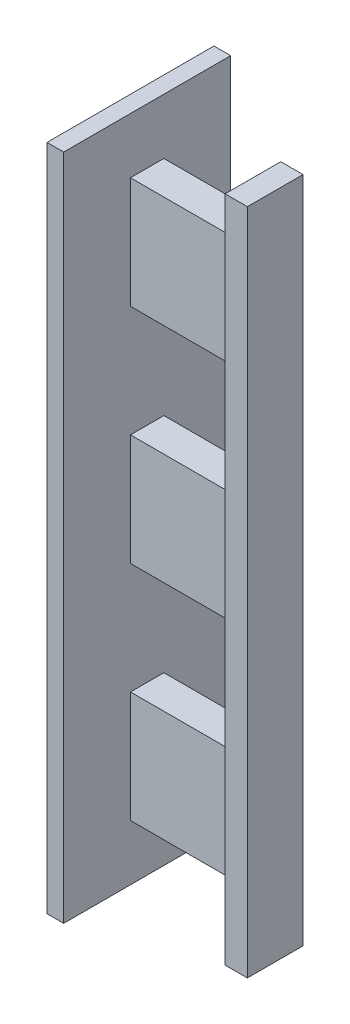
ISO-10303-21;
HEADER;
FILE_DESCRIPTION(('STEP AP214'),'2;1');
FILE_NAME('part.step','',(''),(''),'','','');
FILE_SCHEMA(('AUTOMOTIVE_DESIGN { 1 0 10303 214 1 1 1 1 }'));
ENDSEC;
DATA;
#1=APPLICATION_CONTEXT('core data for automotive mechanical design processes');
#2=APPLICATION_PROTOCOL_DEFINITION('international standard','automotive_design',2000,#1);
#3=PRODUCT_CONTEXT('',#1,'mechanical');
#4=PRODUCT('Part','Part','',(#3));
#5=PRODUCT_RELATED_PRODUCT_CATEGORY('part','',(#4));
#6=PRODUCT_DEFINITION_FORMATION('','',#4);
#7=PRODUCT_DEFINITION_CONTEXT('part definition',#1,'design');
#8=PRODUCT_DEFINITION('design','',#6,#7);
#9=PRODUCT_DEFINITION_SHAPE('','',#8);
#10=(LENGTH_UNIT() NAMED_UNIT(*) SI_UNIT(.MILLI.,.METRE.));
#11=(NAMED_UNIT(*) PLANE_ANGLE_UNIT() SI_UNIT($,.RADIAN.));
#12=(NAMED_UNIT(*) SI_UNIT($,.STERADIAN.) SOLID_ANGLE_UNIT());
#13=UNCERTAINTY_MEASURE_WITH_UNIT(LENGTH_MEASURE(1.E-05),#10,'distance_accuracy_value','');
#14=(GEOMETRIC_REPRESENTATION_CONTEXT(3) GLOBAL_UNCERTAINTY_ASSIGNED_CONTEXT((#13)) GLOBAL_UNIT_ASSIGNED_CONTEXT((#10,
#11,#12)) REPRESENTATION_CONTEXT('',''));
#15=CARTESIAN_POINT('',(0.,0.,0.));
#16=DIRECTION('',(0.,0.,1.));
#17=DIRECTION('',(1.,0.,0.));
#18=AXIS2_PLACEMENT_3D('',#15,#16,#17);
#19=CARTESIAN_POINT('',(0.,0.,0.));
#20=DIRECTION('',(-1.,0.,0.));
#21=DIRECTION('',(0.,0.,1.));
#22=AXIS2_PLACEMENT_3D('',#19,#20,#21);
#23=PLANE('',#22);
#24=DIRECTION('',(0.,1.,0.));
#25=VECTOR('',#24,1.);
#26=CARTESIAN_POINT('',(0.,-30.,-1.50000000000001));
#27=LINE('',#26,#25);
#28=CARTESIAN_POINT('',(0.,25.,-1.5));
#29=VERTEX_POINT('',#28);
#30=CARTESIAN_POINT('',(0.,30.,-1.49999999999999));
#31=VERTEX_POINT('',#30);
#32=EDGE_CURVE('E338',#29,#31,#27,.T.);
#33=ORIENTED_EDGE('',*,*,#32,.F.);
#34=DIRECTION('',(0.,0.,-1.));
#35=VECTOR('',#34,1.);
#36=CARTESIAN_POINT('',(0.,25.,-1.50000000000007));
#37=LINE('',#36,#35);
#38=CARTESIAN_POINT('',(0.,25.,1.49999999999993));
#39=VERTEX_POINT('',#38);
#40=EDGE_CURVE('E233',#39,#29,#37,.T.);
#41=ORIENTED_EDGE('',*,*,#40,.F.);
#42=DIRECTION('',(0.,1.,0.));
#43=VECTOR('',#42,1.);
#44=CARTESIAN_POINT('',(0.,15.,1.49999999999993));
#45=LINE('',#44,#43);
#46=CARTESIAN_POINT('',(0.,15.,1.49999999999993));
#47=VERTEX_POINT('',#46);
#48=EDGE_CURVE('E237',#47,#39,#45,.T.);
#49=ORIENTED_EDGE('',*,*,#48,.F.);
#50=DIRECTION('',(0.,0.,1.));
#51=VECTOR('',#50,1.);
#52=CARTESIAN_POINT('',(0.,15.,-1.50000000000007));
#53=LINE('',#52,#51);
#54=CARTESIAN_POINT('',(0.,15.,-1.50000000000007));
#55=VERTEX_POINT('',#54);
#56=EDGE_CURVE('E230',#55,#47,#53,.T.);
#57=ORIENTED_EDGE('',*,*,#56,.F.);
#58=CARTESIAN_POINT('',(0.,5.,-1.5));
#59=VERTEX_POINT('',#58);
#60=EDGE_CURVE('E360',#59,#55,#27,.T.);
#61=ORIENTED_EDGE('',*,*,#60,.F.);
#62=DIRECTION('',(0.,0.,-1.));
#63=VECTOR('',#62,1.);
#64=CARTESIAN_POINT('',(0.,5.,-1.5));
#65=LINE('',#64,#63);
#66=CARTESIAN_POINT('',(0.,5.,1.5));
#67=VERTEX_POINT('',#66);
#68=EDGE_CURVE('E316',#67,#59,#65,.T.);
#69=ORIENTED_EDGE('',*,*,#68,.F.);
#70=DIRECTION('',(0.,1.,0.));
#71=VECTOR('',#70,1.);
#72=CARTESIAN_POINT('',(0.,-5.,1.5));
#73=LINE('',#72,#71);
#74=CARTESIAN_POINT('',(0.,-5.,1.5));
#75=VERTEX_POINT('',#74);
#76=EDGE_CURVE('E280',#75,#67,#73,.T.);
#77=ORIENTED_EDGE('',*,*,#76,.F.);
#78=DIRECTION('',(0.,0.,1.));
#79=VECTOR('',#78,1.);
#80=CARTESIAN_POINT('',(0.,-5.,-1.5));
#81=LINE('',#80,#79);
#82=CARTESIAN_POINT('',(0.,-5.,-1.5));
#83=VERTEX_POINT('',#82);
#84=EDGE_CURVE('E300',#83,#75,#81,.T.);
#85=ORIENTED_EDGE('',*,*,#84,.F.);
#86=CARTESIAN_POINT('',(0.,-15.,-1.49999999999979));
#87=VERTEX_POINT('',#86);
#88=EDGE_CURVE('E359',#87,#83,#27,.T.);
#89=ORIENTED_EDGE('',*,*,#88,.F.);
#90=DIRECTION('',(0.,0.,-1.));
#91=VECTOR('',#90,1.);
#92=CARTESIAN_POINT('',(0.,-15.,-1.49999999999979));
#93=LINE('',#92,#91);
#94=CARTESIAN_POINT('',(0.,-15.,1.50000000000021));
#95=VERTEX_POINT('',#94);
#96=EDGE_CURVE('E272',#95,#87,#93,.T.);
#97=ORIENTED_EDGE('',*,*,#96,.F.);
#98=DIRECTION('',(0.,1.,0.));
#99=VECTOR('',#98,1.);
#100=CARTESIAN_POINT('',(0.,-25.,1.50000000000021));
#101=LINE('',#100,#99);
#102=CARTESIAN_POINT('',(0.,-25.,1.50000000000021));
#103=VERTEX_POINT('',#102);
#104=EDGE_CURVE('E276',#103,#95,#101,.T.);
#105=ORIENTED_EDGE('',*,*,#104,.F.);
#106=DIRECTION('',(0.,0.,1.));
#107=VECTOR('',#106,1.);
#108=CARTESIAN_POINT('',(0.,-25.,-1.49999999999979));
#109=LINE('',#108,#107);
#110=CARTESIAN_POINT('',(0.,-25.,-1.5));
#111=VERTEX_POINT('',#110);
#112=EDGE_CURVE('E269',#111,#103,#109,.T.);
#113=ORIENTED_EDGE('',*,*,#112,.F.);
#114=CARTESIAN_POINT('',(0.,-30.,-1.50000000000001));
#115=VERTEX_POINT('',#114);
#116=EDGE_CURVE('E354',#115,#111,#27,.T.);
#117=ORIENTED_EDGE('',*,*,#116,.F.);
#118=DIRECTION('',(0.,0.,-1.));
#119=VECTOR('',#118,1.);
#120=CARTESIAN_POINT('',(0.,-30.,3.5));
#121=LINE('',#120,#119);
#122=CARTESIAN_POINT('',(0.,-30.,3.5));
#123=VERTEX_POINT('',#122);
#124=EDGE_CURVE('E344',#123,#115,#121,.T.);
#125=ORIENTED_EDGE('',*,*,#124,.F.);
#126=DIRECTION('',(0.,-1.,0.));
#127=VECTOR('',#126,1.);
#128=CARTESIAN_POINT('',(0.,-30.,3.5));
#129=LINE('',#128,#127);
#130=CARTESIAN_POINT('',(0.,30.,3.50000000000001));
#131=VERTEX_POINT('',#130);
#132=EDGE_CURVE('E363',#131,#123,#129,.T.);
#133=ORIENTED_EDGE('',*,*,#132,.F.);
#134=DIRECTION('',(0.,0.,1.));
#135=VECTOR('',#134,1.);
#136=CARTESIAN_POINT('',(0.,30.,3.50000000000001));
#137=LINE('',#136,#135);
#138=EDGE_CURVE('E358',#31,#131,#137,.T.);
#139=ORIENTED_EDGE('',*,*,#138,.F.);
#140=EDGE_LOOP('',(#33,#41,#49,#57,#61,#69,#77,#85,#89,#97,#105,#113,#117,#125,#133,#139));
#141=FACE_BOUND('',#140,.T.);
#142=ADVANCED_FACE('F45',(#141),#23,.T.);
#143=CARTESIAN_POINT('',(2.,-30.,-1.50000000000001));
#144=DIRECTION('',(0.,0.,1.));
#145=DIRECTION('',(0.,-1.,0.));
#146=AXIS2_PLACEMENT_3D('',#143,#144,#145);
#147=PLANE('',#146);
#148=ORIENTED_EDGE('',*,*,#116,.T.);
#149=DIRECTION('',(1.,0.,0.));
#150=VECTOR('',#149,1.);
#151=CARTESIAN_POINT('',(-10.5,-25.,-1.49999999999979));
#152=LINE('',#151,#150);
#153=CARTESIAN_POINT('',(-10.5,-25.,-1.49999999999979));
#154=VERTEX_POINT('',#153);
#155=EDGE_CURVE('E69',#154,#111,#152,.T.);
#156=ORIENTED_EDGE('',*,*,#155,.F.);
#157=DIRECTION('',(0.,-1.,0.));
#158=VECTOR('',#157,1.);
#159=CARTESIAN_POINT('',(-10.5,-25.,-1.49999999999979));
#160=LINE('',#159,#158);
#161=CARTESIAN_POINT('',(-10.5,-15.,-1.49999999999979));
#162=VERTEX_POINT('',#161);
#163=EDGE_CURVE('E284',#162,#154,#160,.T.);
#164=ORIENTED_EDGE('',*,*,#163,.F.);
#165=DIRECTION('',(1.,0.,0.));
#166=VECTOR('',#165,1.);
#167=CARTESIAN_POINT('',(-10.5,-15.,-1.49999999999979));
#168=LINE('',#167,#166);
#169=EDGE_CURVE('E258',#162,#87,#168,.T.);
#170=ORIENTED_EDGE('',*,*,#169,.T.);
#171=ORIENTED_EDGE('',*,*,#88,.T.);
#172=DIRECTION('',(1.,0.,0.));
#173=VECTOR('',#172,1.);
#174=CARTESIAN_POINT('',(-10.5,-5.,-1.5));
#175=LINE('',#174,#173);
#176=CARTESIAN_POINT('',(-10.5,-5.,-1.5));
#177=VERTEX_POINT('',#176);
#178=EDGE_CURVE('E326',#177,#83,#175,.T.);
#179=ORIENTED_EDGE('',*,*,#178,.F.);
#180=DIRECTION('',(0.,-1.,0.));
#181=VECTOR('',#180,1.);
#182=CARTESIAN_POINT('',(-10.5,-5.,-1.5));
#183=LINE('',#182,#181);
#184=CARTESIAN_POINT('',(-10.5,5.,-1.5));
#185=VERTEX_POINT('',#184);
#186=EDGE_CURVE('E304',#185,#177,#183,.T.);
#187=ORIENTED_EDGE('',*,*,#186,.F.);
#188=DIRECTION('',(1.,0.,0.));
#189=VECTOR('',#188,1.);
#190=CARTESIAN_POINT('',(-10.5,5.,-1.5));
#191=LINE('',#190,#189);
#192=EDGE_CURVE('E330',#185,#59,#191,.T.);
#193=ORIENTED_EDGE('',*,*,#192,.T.);
#194=ORIENTED_EDGE('',*,*,#60,.T.);
#195=DIRECTION('',(1.,0.,0.));
#196=VECTOR('',#195,1.);
#197=CARTESIAN_POINT('',(-10.5,15.,-1.50000000000007));
#198=LINE('',#197,#196);
#199=CARTESIAN_POINT('',(-10.5,15.,-1.50000000000007));
#200=VERTEX_POINT('',#199);
#201=EDGE_CURVE('E222',#200,#55,#198,.T.);
#202=ORIENTED_EDGE('',*,*,#201,.F.);
#203=DIRECTION('',(0.,-1.,0.));
#204=VECTOR('',#203,1.);
#205=CARTESIAN_POINT('',(-10.5,15.,-1.50000000000007));
#206=LINE('',#205,#204);
#207=CARTESIAN_POINT('',(-10.5,25.,-1.50000000000007));
#208=VERTEX_POINT('',#207);
#209=EDGE_CURVE('E245',#208,#200,#206,.T.);
#210=ORIENTED_EDGE('',*,*,#209,.F.);
#211=DIRECTION('',(1.,0.,0.));
#212=VECTOR('',#211,1.);
#213=CARTESIAN_POINT('',(-10.5,25.,-1.50000000000007));
#214=LINE('',#213,#212);
#215=EDGE_CURVE('E61',#208,#29,#214,.T.);
#216=ORIENTED_EDGE('',*,*,#215,.T.);
#217=ORIENTED_EDGE('',*,*,#32,.T.);
#218=DIRECTION('',(-1.,0.,0.));
#219=VECTOR('',#218,1.);
#220=CARTESIAN_POINT('',(2.,30.,-1.49999999999999));
#221=LINE('',#220,#219);
#222=CARTESIAN_POINT('',(2.,30.,-1.49999999999999));
#223=VERTEX_POINT('',#222);
#224=EDGE_CURVE('E11',#223,#31,#221,.T.);
#225=ORIENTED_EDGE('',*,*,#224,.F.);
#226=DIRECTION('',(0.,1.,0.));
#227=VECTOR('',#226,1.);
#228=CARTESIAN_POINT('',(2.,-30.,-1.50000000000001));
#229=LINE('',#228,#227);
#230=CARTESIAN_POINT('',(2.,-30.,-1.50000000000001));
#231=VERTEX_POINT('',#230);
#232=EDGE_CURVE('E339',#231,#223,#229,.T.);
#233=ORIENTED_EDGE('',*,*,#232,.F.);
#234=DIRECTION('',(-1.,0.,0.));
#235=VECTOR('',#234,1.);
#236=CARTESIAN_POINT('',(2.,-30.,-1.50000000000001));
#237=LINE('',#236,#235);
#238=EDGE_CURVE('E353',#231,#115,#237,.T.);
#239=ORIENTED_EDGE('',*,*,#238,.T.);
#240=EDGE_LOOP('',(#148,#156,#164,#170,#171,#179,#187,#193,#194,#202,#210,#216,#217,#225,#233,#239));
#241=FACE_BOUND('',#240,.T.);
#242=ADVANCED_FACE('F47',(#241),#147,.F.);
#243=CARTESIAN_POINT('',(2.,30.,3.50000000000001));
#244=DIRECTION('',(0.,-1.,0.));
#245=DIRECTION('',(0.,0.,-1.));
#246=AXIS2_PLACEMENT_3D('',#243,#244,#245);
#247=PLANE('',#246);
#248=ORIENTED_EDGE('',*,*,#138,.T.);
#249=DIRECTION('',(-1.,0.,0.));
#250=VECTOR('',#249,1.);
#251=CARTESIAN_POINT('',(2.,30.,3.50000000000001));
#252=LINE('',#251,#250);
#253=CARTESIAN_POINT('',(2.,30.,3.50000000000001));
#254=VERTEX_POINT('',#253);
#255=EDGE_CURVE('E54',#254,#131,#252,.T.);
#256=ORIENTED_EDGE('',*,*,#255,.F.);
#257=DIRECTION('',(0.,0.,1.));
#258=VECTOR('',#257,1.);
#259=CARTESIAN_POINT('',(2.,30.,3.50000000000001));
#260=LINE('',#259,#258);
#261=EDGE_CURVE('E343',#223,#254,#260,.T.);
#262=ORIENTED_EDGE('',*,*,#261,.F.);
#263=ORIENTED_EDGE('',*,*,#224,.T.);
#264=EDGE_LOOP('',(#248,#256,#262,#263));
#265=FACE_BOUND('',#264,.T.);
#266=ADVANCED_FACE('F396',(#265),#247,.F.);
#267=CARTESIAN_POINT('',(2.,-30.,3.5));
#268=DIRECTION('',(0.,0.,-1.));
#269=DIRECTION('',(0.,1.,0.));
#270=AXIS2_PLACEMENT_3D('',#267,#268,#269);
#271=PLANE('',#270);
#272=ORIENTED_EDGE('',*,*,#132,.T.);
#273=DIRECTION('',(-1.,0.,0.));
#274=VECTOR('',#273,1.);
#275=CARTESIAN_POINT('',(2.,-30.,3.5));
#276=LINE('',#275,#274);
#277=CARTESIAN_POINT('',(2.,-30.,3.5));
#278=VERTEX_POINT('',#277);
#279=EDGE_CURVE('E371',#278,#123,#276,.T.);
#280=ORIENTED_EDGE('',*,*,#279,.F.);
#281=DIRECTION('',(0.,-1.,0.));
#282=VECTOR('',#281,1.);
#283=CARTESIAN_POINT('',(2.,-30.,3.5));
#284=LINE('',#283,#282);
#285=EDGE_CURVE('E347',#254,#278,#284,.T.);
#286=ORIENTED_EDGE('',*,*,#285,.F.);
#287=ORIENTED_EDGE('',*,*,#255,.T.);
#288=EDGE_LOOP('',(#272,#280,#286,#287));
#289=FACE_BOUND('',#288,.T.);
#290=ADVANCED_FACE('F380',(#289),#271,.F.);
#291=CARTESIAN_POINT('',(2.,-30.,3.5));
#292=DIRECTION('',(0.,1.,0.));
#293=DIRECTION('',(0.,0.,1.));
#294=AXIS2_PLACEMENT_3D('',#291,#292,#293);
#295=PLANE('',#294);
#296=ORIENTED_EDGE('',*,*,#124,.T.);
#297=ORIENTED_EDGE('',*,*,#238,.F.);
#298=DIRECTION('',(0.,0.,-1.));
#299=VECTOR('',#298,1.);
#300=CARTESIAN_POINT('',(2.,-30.,3.5));
#301=LINE('',#300,#299);
#302=EDGE_CURVE('E350',#278,#231,#301,.T.);
#303=ORIENTED_EDGE('',*,*,#302,.F.);
#304=ORIENTED_EDGE('',*,*,#279,.T.);
#305=EDGE_LOOP('',(#296,#297,#303,#304));
#306=FACE_BOUND('',#305,.T.);
#307=ADVANCED_FACE('F390',(#306),#295,.F.);
#308=CARTESIAN_POINT('',(2.,0.,0.));
#309=DIRECTION('',(-1.,0.,0.));
#310=DIRECTION('',(0.,0.,1.));
#311=AXIS2_PLACEMENT_3D('',#308,#309,#310);
#312=PLANE('',#311);
#313=ORIENTED_EDGE('',*,*,#232,.T.);
#314=ORIENTED_EDGE('',*,*,#261,.T.);
#315=ORIENTED_EDGE('',*,*,#285,.T.);
#316=ORIENTED_EDGE('',*,*,#302,.T.);
#317=EDGE_LOOP('',(#313,#314,#315,#316));
#318=FACE_BOUND('',#317,.T.);
#319=ADVANCED_FACE('F395',(#318),#312,.F.);
#320=CARTESIAN_POINT('',(-10.5,-5.,1.5));
#321=DIRECTION('',(0.,0.,-1.));
#322=DIRECTION('',(-1.,0.,0.));
#323=AXIS2_PLACEMENT_3D('',#320,#321,#322);
#324=PLANE('',#323);
#325=ORIENTED_EDGE('',*,*,#76,.T.);
#326=DIRECTION('',(1.,0.,0.));
#327=VECTOR('',#326,1.);
#328=CARTESIAN_POINT('',(-10.5,5.,1.5));
#329=LINE('',#328,#327);
#330=CARTESIAN_POINT('',(-10.5,5.,1.5));
#331=VERTEX_POINT('',#330);
#332=EDGE_CURVE('E334',#331,#67,#329,.T.);
#333=ORIENTED_EDGE('',*,*,#332,.F.);
#334=DIRECTION('',(0.,1.,0.));
#335=VECTOR('',#334,1.);
#336=CARTESIAN_POINT('',(-10.5,-5.,1.5));
#337=LINE('',#336,#335);
#338=CARTESIAN_POINT('',(-10.5,-5.,1.5));
#339=VERTEX_POINT('',#338);
#340=EDGE_CURVE('E295',#339,#331,#337,.T.);
#341=ORIENTED_EDGE('',*,*,#340,.F.);
#342=DIRECTION('',(1.,0.,0.));
#343=VECTOR('',#342,1.);
#344=CARTESIAN_POINT('',(-10.5,-5.,1.5));
#345=LINE('',#344,#343);
#346=EDGE_CURVE('E312',#339,#75,#345,.T.);
#347=ORIENTED_EDGE('',*,*,#346,.T.);
#348=EDGE_LOOP('',(#325,#333,#341,#347));
#349=FACE_BOUND('',#348,.T.);
#350=ADVANCED_FACE('F414',(#349),#324,.F.);
#351=CARTESIAN_POINT('',(-10.5,5.,-1.5));
#352=DIRECTION('',(0.,-1.,0.));
#353=DIRECTION('',(0.,0.,-1.));
#354=AXIS2_PLACEMENT_3D('',#351,#352,#353);
#355=PLANE('',#354);
#356=ORIENTED_EDGE('',*,*,#68,.T.);
#357=ORIENTED_EDGE('',*,*,#192,.F.);
#358=DIRECTION('',(0.,0.,-1.));
#359=VECTOR('',#358,1.);
#360=CARTESIAN_POINT('',(-10.5,5.,-1.5));
#361=LINE('',#360,#359);
#362=EDGE_CURVE('E299',#331,#185,#361,.T.);
#363=ORIENTED_EDGE('',*,*,#362,.F.);
#364=ORIENTED_EDGE('',*,*,#332,.T.);
#365=EDGE_LOOP('',(#356,#357,#363,#364));
#366=FACE_BOUND('',#365,.T.);
#367=ADVANCED_FACE('F418',(#366),#355,.F.);
#368=CARTESIAN_POINT('',(-10.5,-5.,-1.5));
#369=DIRECTION('',(0.,1.,0.));
#370=DIRECTION('',(0.,0.,1.));
#371=AXIS2_PLACEMENT_3D('',#368,#369,#370);
#372=PLANE('',#371);
#373=ORIENTED_EDGE('',*,*,#84,.T.);
#374=ORIENTED_EDGE('',*,*,#346,.F.);
#375=DIRECTION('',(0.,0.,1.));
#376=VECTOR('',#375,1.);
#377=CARTESIAN_POINT('',(-10.5,-5.,-1.5));
#378=LINE('',#377,#376);
#379=EDGE_CURVE('E308',#177,#339,#378,.T.);
#380=ORIENTED_EDGE('',*,*,#379,.F.);
#381=ORIENTED_EDGE('',*,*,#178,.T.);
#382=EDGE_LOOP('',(#373,#374,#380,#381));
#383=FACE_BOUND('',#382,.T.);
#384=ADVANCED_FACE('F423',(#383),#372,.F.);
#385=CARTESIAN_POINT('',(-10.5,-25.,1.50000000000021));
#386=DIRECTION('',(0.,0.,-1.));
#387=DIRECTION('',(-1.,0.,0.));
#388=AXIS2_PLACEMENT_3D('',#385,#386,#387);
#389=PLANE('',#388);
#390=ORIENTED_EDGE('',*,*,#104,.T.);
#391=DIRECTION('',(1.,0.,0.));
#392=VECTOR('',#391,1.);
#393=CARTESIAN_POINT('',(-10.5,-15.,1.50000000000021));
#394=LINE('',#393,#392);
#395=CARTESIAN_POINT('',(-10.5,-15.,1.50000000000021));
#396=VERTEX_POINT('',#395);
#397=EDGE_CURVE('E241',#396,#95,#394,.T.);
#398=ORIENTED_EDGE('',*,*,#397,.F.);
#399=DIRECTION('',(0.,1.,0.));
#400=VECTOR('',#399,1.);
#401=CARTESIAN_POINT('',(-10.5,-25.,1.50000000000021));
#402=LINE('',#401,#400);
#403=CARTESIAN_POINT('',(-10.5,-25.,1.50000000000021));
#404=VERTEX_POINT('',#403);
#405=EDGE_CURVE('E273',#404,#396,#402,.T.);
#406=ORIENTED_EDGE('',*,*,#405,.F.);
#407=DIRECTION('',(1.,0.,0.));
#408=VECTOR('',#407,1.);
#409=CARTESIAN_POINT('',(-10.5,-25.,1.50000000000021));
#410=LINE('',#409,#408);
#411=EDGE_CURVE('E264',#404,#103,#410,.T.);
#412=ORIENTED_EDGE('',*,*,#411,.T.);
#413=EDGE_LOOP('',(#390,#398,#406,#412));
#414=FACE_BOUND('',#413,.T.);
#415=ADVANCED_FACE('F429',(#414),#389,.F.);
#416=CARTESIAN_POINT('',(-10.5,-15.,-1.49999999999979));
#417=DIRECTION('',(0.,-1.,0.));
#418=DIRECTION('',(0.,0.,-1.));
#419=AXIS2_PLACEMENT_3D('',#416,#417,#418);
#420=PLANE('',#419);
#421=ORIENTED_EDGE('',*,*,#96,.T.);
#422=ORIENTED_EDGE('',*,*,#169,.F.);
#423=DIRECTION('',(0.,0.,-1.));
#424=VECTOR('',#423,1.);
#425=CARTESIAN_POINT('',(-10.5,-15.,-1.49999999999979));
#426=LINE('',#425,#424);
#427=EDGE_CURVE('E288',#396,#162,#426,.T.);
#428=ORIENTED_EDGE('',*,*,#427,.F.);
#429=ORIENTED_EDGE('',*,*,#397,.T.);
#430=EDGE_LOOP('',(#421,#422,#428,#429));
#431=FACE_BOUND('',#430,.T.);
#432=ADVANCED_FACE('F435',(#431),#420,.F.);
#433=CARTESIAN_POINT('',(-10.5,-25.,-1.49999999999979));
#434=DIRECTION('',(0.,1.,0.));
#435=DIRECTION('',(0.,0.,1.));
#436=AXIS2_PLACEMENT_3D('',#433,#434,#435);
#437=PLANE('',#436);
#438=ORIENTED_EDGE('',*,*,#112,.T.);
#439=ORIENTED_EDGE('',*,*,#411,.F.);
#440=DIRECTION('',(0.,0.,1.));
#441=VECTOR('',#440,1.);
#442=CARTESIAN_POINT('',(-10.5,-25.,-1.49999999999979));
#443=LINE('',#442,#441);
#444=EDGE_CURVE('E268',#154,#404,#443,.T.);
#445=ORIENTED_EDGE('',*,*,#444,.F.);
#446=ORIENTED_EDGE('',*,*,#155,.T.);
#447=EDGE_LOOP('',(#438,#439,#445,#446));
#448=FACE_BOUND('',#447,.T.);
#449=ADVANCED_FACE('F431',(#448),#437,.F.);
#450=CARTESIAN_POINT('',(-10.5,15.,1.49999999999993));
#451=DIRECTION('',(0.,0.,-1.));
#452=DIRECTION('',(-1.,0.,0.));
#453=AXIS2_PLACEMENT_3D('',#450,#451,#452);
#454=PLANE('',#453);
#455=ORIENTED_EDGE('',*,*,#48,.T.);
#456=DIRECTION('',(1.,0.,0.));
#457=VECTOR('',#456,1.);
#458=CARTESIAN_POINT('',(-10.5,25.,1.49999999999993));
#459=LINE('',#458,#457);
#460=CARTESIAN_POINT('',(-10.5,25.,1.49999999999993));
#461=VERTEX_POINT('',#460);
#462=EDGE_CURVE('E211',#461,#39,#459,.T.);
#463=ORIENTED_EDGE('',*,*,#462,.F.);
#464=DIRECTION('',(0.,1.,0.));
#465=VECTOR('',#464,1.);
#466=CARTESIAN_POINT('',(-10.5,15.,1.49999999999993));
#467=LINE('',#466,#465);
#468=CARTESIAN_POINT('',(-10.5,15.,1.49999999999993));
#469=VERTEX_POINT('',#468);
#470=EDGE_CURVE('E234',#469,#461,#467,.T.);
#471=ORIENTED_EDGE('',*,*,#470,.F.);
#472=DIRECTION('',(1.,0.,0.));
#473=VECTOR('',#472,1.);
#474=CARTESIAN_POINT('',(-10.5,15.,1.49999999999993));
#475=LINE('',#474,#473);
#476=EDGE_CURVE('E225',#469,#47,#475,.T.);
#477=ORIENTED_EDGE('',*,*,#476,.T.);
#478=EDGE_LOOP('',(#455,#463,#471,#477));
#479=FACE_BOUND('',#478,.T.);
#480=ADVANCED_FACE('F434',(#479),#454,.F.);
#481=CARTESIAN_POINT('',(-10.5,25.,-1.50000000000007));
#482=DIRECTION('',(0.,-1.,0.));
#483=DIRECTION('',(0.,0.,-1.));
#484=AXIS2_PLACEMENT_3D('',#481,#482,#483);
#485=PLANE('',#484);
#486=ORIENTED_EDGE('',*,*,#40,.T.);
#487=ORIENTED_EDGE('',*,*,#215,.F.);
#488=DIRECTION('',(0.,0.,-1.));
#489=VECTOR('',#488,1.);
#490=CARTESIAN_POINT('',(-10.5,25.,-1.50000000000007));
#491=LINE('',#490,#489);
#492=EDGE_CURVE('E249',#461,#208,#491,.T.);
#493=ORIENTED_EDGE('',*,*,#492,.F.);
#494=ORIENTED_EDGE('',*,*,#462,.T.);
#495=EDGE_LOOP('',(#486,#487,#493,#494));
#496=FACE_BOUND('',#495,.T.);
#497=ADVANCED_FACE('F446',(#496),#485,.F.);
#498=CARTESIAN_POINT('',(-10.5,15.,-1.50000000000007));
#499=DIRECTION('',(0.,1.,0.));
#500=DIRECTION('',(0.,0.,1.));
#501=AXIS2_PLACEMENT_3D('',#498,#499,#500);
#502=PLANE('',#501);
#503=ORIENTED_EDGE('',*,*,#56,.T.);
#504=ORIENTED_EDGE('',*,*,#476,.F.);
#505=DIRECTION('',(0.,0.,1.));
#506=VECTOR('',#505,1.);
#507=CARTESIAN_POINT('',(-10.5,15.,-1.50000000000007));
#508=LINE('',#507,#506);
#509=EDGE_CURVE('E229',#200,#469,#508,.T.);
#510=ORIENTED_EDGE('',*,*,#509,.F.);
#511=ORIENTED_EDGE('',*,*,#201,.T.);
#512=EDGE_LOOP('',(#503,#504,#510,#511));
#513=FACE_BOUND('',#512,.T.);
#514=ADVANCED_FACE('F442',(#513),#502,.F.);
#515=CARTESIAN_POINT('',(-10.5,0.,0.));
#516=DIRECTION('',(1.,0.,0.));
#517=DIRECTION('',(0.,0.,-1.));
#518=AXIS2_PLACEMENT_3D('',#515,#516,#517);
#519=PLANE('',#518);
#520=ORIENTED_EDGE('',*,*,#427,.T.);
#521=ORIENTED_EDGE('',*,*,#163,.T.);
#522=ORIENTED_EDGE('',*,*,#444,.T.);
#523=ORIENTED_EDGE('',*,*,#405,.T.);
#524=EDGE_LOOP('',(#520,#521,#522,#523));
#525=FACE_BOUND('',#524,.T.);
#526=DIRECTION('',(0.,1.,0.));
#527=VECTOR('',#526,1.);
#528=CARTESIAN_POINT('',(-10.5,-30.,7.5));
#529=LINE('',#528,#527);
#530=CARTESIAN_POINT('',(-10.5,-30.,7.5));
#531=VERTEX_POINT('',#530);
#532=CARTESIAN_POINT('',(-10.5,30.,7.5));
#533=VERTEX_POINT('',#532);
#534=EDGE_CURVE('E209',#531,#533,#529,.T.);
#535=ORIENTED_EDGE('',*,*,#534,.F.);
#536=DIRECTION('',(0.,0.,1.));
#537=VECTOR('',#536,1.);
#538=CARTESIAN_POINT('',(-10.5,-30.,-7.5));
#539=LINE('',#538,#537);
#540=CARTESIAN_POINT('',(-10.5,-30.,-7.5));
#541=VERTEX_POINT('',#540);
#542=EDGE_CURVE('E205',#541,#531,#539,.T.);
#543=ORIENTED_EDGE('',*,*,#542,.F.);
#544=DIRECTION('',(0.,-1.,0.));
#545=VECTOR('',#544,1.);
#546=CARTESIAN_POINT('',(-10.5,-30.,-7.5));
#547=LINE('',#546,#545);
#548=CARTESIAN_POINT('',(-10.5,30.,-7.5));
#549=VERTEX_POINT('',#548);
#550=EDGE_CURVE('E667',#549,#541,#547,.T.);
#551=ORIENTED_EDGE('',*,*,#550,.F.);
#552=DIRECTION('',(0.,0.,-1.));
#553=VECTOR('',#552,1.);
#554=CARTESIAN_POINT('',(-10.5,30.,-7.5));
#555=LINE('',#554,#553);
#556=EDGE_CURVE('E663',#533,#549,#555,.T.);
#557=ORIENTED_EDGE('',*,*,#556,.F.);
#558=EDGE_LOOP('',(#535,#543,#551,#557));
#559=FACE_BOUND('',#558,.T.);
#560=ORIENTED_EDGE('',*,*,#492,.T.);
#561=ORIENTED_EDGE('',*,*,#209,.T.);
#562=ORIENTED_EDGE('',*,*,#509,.T.);
#563=ORIENTED_EDGE('',*,*,#470,.T.);
#564=EDGE_LOOP('',(#560,#561,#562,#563));
#565=FACE_BOUND('',#564,.T.);
#566=ORIENTED_EDGE('',*,*,#362,.T.);
#567=ORIENTED_EDGE('',*,*,#186,.T.);
#568=ORIENTED_EDGE('',*,*,#379,.T.);
#569=ORIENTED_EDGE('',*,*,#340,.T.);
#570=EDGE_LOOP('',(#566,#567,#568,#569));
#571=FACE_BOUND('',#570,.T.);
#572=ADVANCED_FACE('F445',(#525,#559,#565,#571),#519,.T.);
#573=CARTESIAN_POINT('',(-12.,-30.,7.5));
#574=DIRECTION('',(0.,0.,-1.));
#575=DIRECTION('',(-1.,0.,0.));
#576=AXIS2_PLACEMENT_3D('',#573,#574,#575);
#577=PLANE('',#576);
#578=ORIENTED_EDGE('',*,*,#534,.T.);
#579=DIRECTION('',(1.,0.,0.));
#580=VECTOR('',#579,1.);
#581=CARTESIAN_POINT('',(-12.,30.,7.5));
#582=LINE('',#581,#580);
#583=CARTESIAN_POINT('',(-12.,30.,7.5));
#584=VERTEX_POINT('',#583);
#585=EDGE_CURVE('E187',#584,#533,#582,.T.);
#586=ORIENTED_EDGE('',*,*,#585,.F.);
#587=DIRECTION('',(0.,1.,0.));
#588=VECTOR('',#587,1.);
#589=CARTESIAN_POINT('',(-12.,-30.,7.5));
#590=LINE('',#589,#588);
#591=CARTESIAN_POINT('',(-12.,-30.,7.5));
#592=VERTEX_POINT('',#591);
#593=EDGE_CURVE('E195',#592,#584,#590,.T.);
#594=ORIENTED_EDGE('',*,*,#593,.F.);
#595=DIRECTION('',(1.,0.,0.));
#596=VECTOR('',#595,1.);
#597=CARTESIAN_POINT('',(-12.,-30.,7.5));
#598=LINE('',#597,#596);
#599=EDGE_CURVE('E676',#592,#531,#598,.T.);
#600=ORIENTED_EDGE('',*,*,#599,.T.);
#601=EDGE_LOOP('',(#578,#586,#594,#600));
#602=FACE_BOUND('',#601,.T.);
#603=ADVANCED_FACE('F207',(#602),#577,.F.);
#604=CARTESIAN_POINT('',(-12.,30.,-7.5));
#605=DIRECTION('',(0.,-1.,0.));
#606=DIRECTION('',(0.,0.,-1.));
#607=AXIS2_PLACEMENT_3D('',#604,#605,#606);
#608=PLANE('',#607);
#609=ORIENTED_EDGE('',*,*,#556,.T.);
#610=DIRECTION('',(1.,0.,0.));
#611=VECTOR('',#610,1.);
#612=CARTESIAN_POINT('',(-12.,30.,-7.5));
#613=LINE('',#612,#611);
#614=CARTESIAN_POINT('',(-12.,30.,-7.5));
#615=VERTEX_POINT('',#614);
#616=EDGE_CURVE('E190',#615,#549,#613,.T.);
#617=ORIENTED_EDGE('',*,*,#616,.F.);
#618=DIRECTION('',(0.,0.,-1.));
#619=VECTOR('',#618,1.);
#620=CARTESIAN_POINT('',(-12.,30.,-7.5));
#621=LINE('',#620,#619);
#622=EDGE_CURVE('E183',#584,#615,#621,.T.);
#623=ORIENTED_EDGE('',*,*,#622,.F.);
#624=ORIENTED_EDGE('',*,*,#585,.T.);
#625=EDGE_LOOP('',(#609,#617,#623,#624));
#626=FACE_BOUND('',#625,.T.);
#627=ADVANCED_FACE('F185',(#626),#608,.F.);
#628=CARTESIAN_POINT('',(-12.,-30.,-7.5));
#629=DIRECTION('',(0.,0.,1.));
#630=DIRECTION('',(1.,0.,0.));
#631=AXIS2_PLACEMENT_3D('',#628,#629,#630);
#632=PLANE('',#631);
#633=ORIENTED_EDGE('',*,*,#550,.T.);
#634=DIRECTION('',(1.,0.,0.));
#635=VECTOR('',#634,1.);
#636=CARTESIAN_POINT('',(-12.,-30.,-7.5));
#637=LINE('',#636,#635);
#638=CARTESIAN_POINT('',(-12.,-30.,-7.5));
#639=VERTEX_POINT('',#638);
#640=EDGE_CURVE('E216',#639,#541,#637,.T.);
#641=ORIENTED_EDGE('',*,*,#640,.F.);
#642=DIRECTION('',(0.,-1.,0.));
#643=VECTOR('',#642,1.);
#644=CARTESIAN_POINT('',(-12.,-30.,-7.5));
#645=LINE('',#644,#643);
#646=EDGE_CURVE('E194',#615,#639,#645,.T.);
#647=ORIENTED_EDGE('',*,*,#646,.F.);
#648=ORIENTED_EDGE('',*,*,#616,.T.);
#649=EDGE_LOOP('',(#633,#641,#647,#648));
#650=FACE_BOUND('',#649,.T.);
#651=ADVANCED_FACE('F458',(#650),#632,.F.);
#652=CARTESIAN_POINT('',(-12.,-30.,-7.5));
#653=DIRECTION('',(0.,1.,0.));
#654=DIRECTION('',(0.,0.,1.));
#655=AXIS2_PLACEMENT_3D('',#652,#653,#654);
#656=PLANE('',#655);
#657=ORIENTED_EDGE('',*,*,#542,.T.);
#658=ORIENTED_EDGE('',*,*,#599,.F.);
#659=DIRECTION('',(0.,0.,1.));
#660=VECTOR('',#659,1.);
#661=CARTESIAN_POINT('',(-12.,-30.,-7.5));
#662=LINE('',#661,#660);
#663=EDGE_CURVE('E200',#639,#592,#662,.T.);
#664=ORIENTED_EDGE('',*,*,#663,.F.);
#665=ORIENTED_EDGE('',*,*,#640,.T.);
#666=EDGE_LOOP('',(#657,#658,#664,#665));
#667=FACE_BOUND('',#666,.T.);
#668=ADVANCED_FACE('F461',(#667),#656,.F.);
#669=CARTESIAN_POINT('',(-12.,0.,0.));
#670=DIRECTION('',(1.,0.,0.));
#671=DIRECTION('',(0.,0.,-1.));
#672=AXIS2_PLACEMENT_3D('',#669,#670,#671);
#673=PLANE('',#672);
#674=ORIENTED_EDGE('',*,*,#593,.T.);
#675=ORIENTED_EDGE('',*,*,#622,.T.);
#676=ORIENTED_EDGE('',*,*,#646,.T.);
#677=ORIENTED_EDGE('',*,*,#663,.T.);
#678=EDGE_LOOP('',(#674,#675,#676,#677));
#679=FACE_BOUND('',#678,.T.);
#680=ADVANCED_FACE('F198',(#679),#673,.F.);
#681=CLOSED_SHELL('',(#142,#242,#266,#290,#307,#319,#350,#367,#384,#415,#432,#449,#480,#497,
#514,#572,#603,#627,#651,#668,#680));
#682=MANIFOLD_SOLID_BREP('B2',#681);
#683=ADVANCED_BREP_SHAPE_REPRESENTATION('',(#18,#682),#14);
#684=SHAPE_DEFINITION_REPRESENTATION(#9,#683);
ENDSEC;
END-ISO-10303-21;
